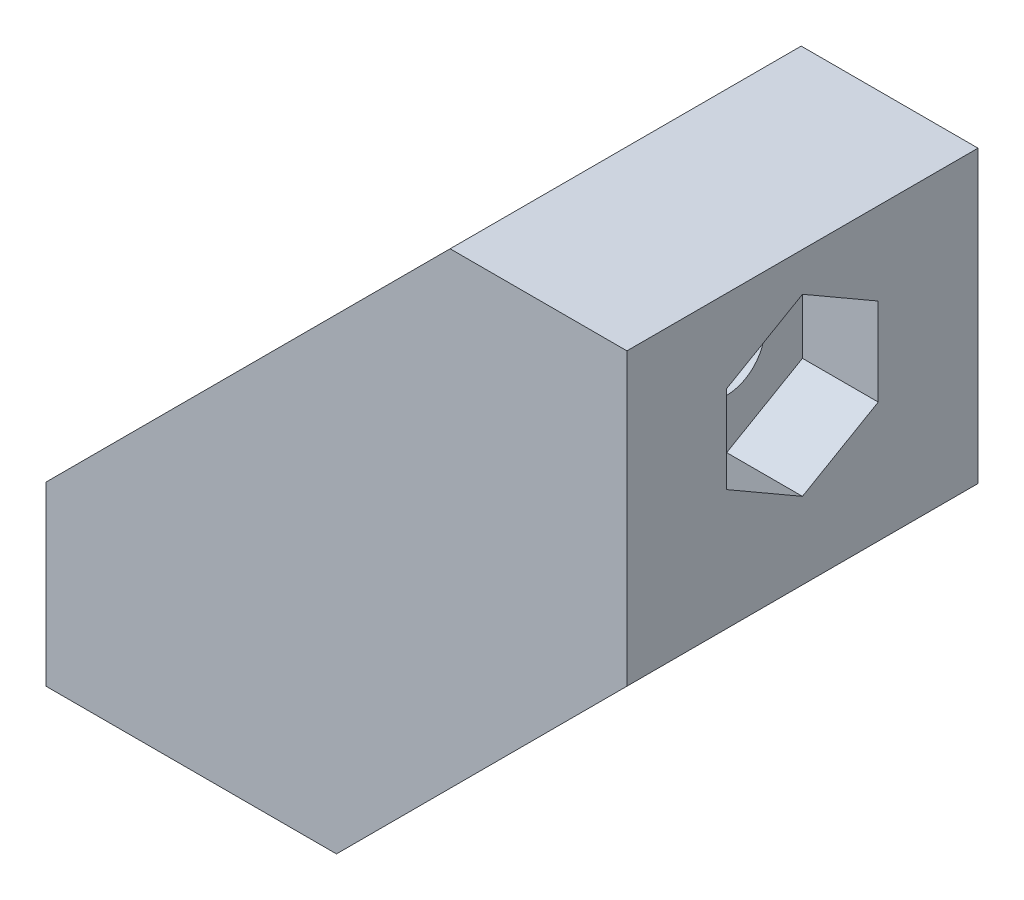
ISO-10303-21;
HEADER;
FILE_DESCRIPTION(('STEP AP214'),'2;1');
FILE_NAME('part.step','',(''),(''),'','','');
FILE_SCHEMA(('AUTOMOTIVE_DESIGN { 1 0 10303 214 1 1 1 1 }'));
ENDSEC;
DATA;
#1=APPLICATION_CONTEXT('core data for automotive mechanical design processes');
#2=APPLICATION_PROTOCOL_DEFINITION('international standard','automotive_design',2000,#1);
#3=PRODUCT_CONTEXT('',#1,'mechanical');
#4=PRODUCT('Part','Part','',(#3));
#5=PRODUCT_RELATED_PRODUCT_CATEGORY('part','',(#4));
#6=PRODUCT_DEFINITION_FORMATION('','',#4);
#7=PRODUCT_DEFINITION_CONTEXT('part definition',#1,'design');
#8=PRODUCT_DEFINITION('design','',#6,#7);
#9=PRODUCT_DEFINITION_SHAPE('','',#8);
#10=(LENGTH_UNIT() NAMED_UNIT(*) SI_UNIT(.MILLI.,.METRE.));
#11=(NAMED_UNIT(*) PLANE_ANGLE_UNIT() SI_UNIT($,.RADIAN.));
#12=(NAMED_UNIT(*) SI_UNIT($,.STERADIAN.) SOLID_ANGLE_UNIT());
#13=UNCERTAINTY_MEASURE_WITH_UNIT(LENGTH_MEASURE(1.E-05),#10,'distance_accuracy_value','');
#14=(GEOMETRIC_REPRESENTATION_CONTEXT(3) GLOBAL_UNCERTAINTY_ASSIGNED_CONTEXT((#13)) GLOBAL_UNIT_ASSIGNED_CONTEXT((#10,
#11,#12)) REPRESENTATION_CONTEXT('',''));
#15=CARTESIAN_POINT('',(0.,0.,0.));
#16=DIRECTION('',(0.,0.,1.));
#17=DIRECTION('',(1.,0.,0.));
#18=AXIS2_PLACEMENT_3D('',#15,#16,#17);
#19=CARTESIAN_POINT('',(22.,11.,-3.95));
#20=DIRECTION('',(1.,0.,0.));
#21=DIRECTION('',(0.,1.,0.));
#22=AXIS2_PLACEMENT_3D('',#19,#20,#21);
#23=CYLINDRICAL_SURFACE('',#22,1.5);
#24=CARTESIAN_POINT('',(38.,11.,-3.95));
#25=DIRECTION('',(1.,0.,0.));
#26=DIRECTION('',(0.,0.,-1.));
#27=AXIS2_PLACEMENT_3D('',#24,#25,#26);
#28=CIRCLE('',#27,1.5);
#29=CARTESIAN_POINT('',(38.,12.5,-3.95));
#30=VERTEX_POINT('',#29);
#31=EDGE_CURVE('E358',#30,#30,#28,.F.);
#32=CARTESIAN_POINT('',(42.,11.,-3.95));
#33=DIRECTION('',(1.,0.,0.));
#34=DIRECTION('',(0.,1.,0.));
#35=AXIS2_PLACEMENT_3D('',#32,#33,#34);
#36=CIRCLE('',#35,1.5);
#37=CARTESIAN_POINT('',(42.,12.5,-3.95));
#38=VERTEX_POINT('',#37);
#39=EDGE_CURVE('E43',#38,#38,#36,.T.);
#40=CARTESIAN_POINT('',(38.,12.5,-3.95));
#41=CARTESIAN_POINT('',(38.0416666666667,12.5,-3.95));
#42=CARTESIAN_POINT('',(38.0833333333333,12.5,-3.95));
#43=CARTESIAN_POINT('',(38.1666666666667,12.5,-3.95));
#44=CARTESIAN_POINT('',(38.2083333333333,12.5,-3.95));
#45=CARTESIAN_POINT('',(38.2916666666667,12.5,-3.95));
#46=CARTESIAN_POINT('',(38.3333333333333,12.5,-3.95));
#47=CARTESIAN_POINT('',(38.4166666666667,12.5,-3.95));
#48=CARTESIAN_POINT('',(38.4583333333333,12.5,-3.95));
#49=CARTESIAN_POINT('',(38.5416666666667,12.5,-3.95));
#50=CARTESIAN_POINT('',(38.5833333333333,12.5,-3.95));
#51=CARTESIAN_POINT('',(38.6666666666667,12.5,-3.95));
#52=CARTESIAN_POINT('',(38.7083333333333,12.5,-3.95));
#53=CARTESIAN_POINT('',(38.7916666666667,12.5,-3.95));
#54=CARTESIAN_POINT('',(38.8333333333333,12.5,-3.95));
#55=CARTESIAN_POINT('',(38.9166666666667,12.5,-3.95));
#56=CARTESIAN_POINT('',(38.9583333333333,12.5,-3.95));
#57=CARTESIAN_POINT('',(39.0416666666667,12.5,-3.95));
#58=CARTESIAN_POINT('',(39.0833333333333,12.5,-3.95));
#59=CARTESIAN_POINT('',(39.1666666666667,12.5,-3.95));
#60=CARTESIAN_POINT('',(39.2083333333333,12.5,-3.95));
#61=CARTESIAN_POINT('',(39.2916666666667,12.5,-3.95));
#62=CARTESIAN_POINT('',(39.3333333333333,12.5,-3.95));
#63=CARTESIAN_POINT('',(39.4166666666667,12.5,-3.95));
#64=CARTESIAN_POINT('',(39.4583333333333,12.5,-3.95));
#65=CARTESIAN_POINT('',(39.5416666666667,12.5,-3.95));
#66=CARTESIAN_POINT('',(39.5833333333333,12.5,-3.95));
#67=CARTESIAN_POINT('',(39.6666666666667,12.5,-3.95));
#68=CARTESIAN_POINT('',(39.7083333333333,12.5,-3.95));
#69=CARTESIAN_POINT('',(39.7916666666667,12.5,-3.95));
#70=CARTESIAN_POINT('',(39.8333333333333,12.5,-3.95));
#71=CARTESIAN_POINT('',(39.9166666666667,12.5,-3.95));
#72=CARTESIAN_POINT('',(39.9583333333333,12.5,-3.95));
#73=CARTESIAN_POINT('',(40.0416666666667,12.5,-3.95));
#74=CARTESIAN_POINT('',(40.0833333333333,12.5,-3.95));
#75=CARTESIAN_POINT('',(40.1666666666667,12.5,-3.95));
#76=CARTESIAN_POINT('',(40.2083333333333,12.5,-3.95));
#77=CARTESIAN_POINT('',(40.2916666666667,12.5,-3.95));
#78=CARTESIAN_POINT('',(40.3333333333333,12.5,-3.95));
#79=CARTESIAN_POINT('',(40.4166666666667,12.5,-3.95));
#80=CARTESIAN_POINT('',(40.4583333333333,12.5,-3.95));
#81=CARTESIAN_POINT('',(40.5416666666667,12.5,-3.95));
#82=CARTESIAN_POINT('',(40.5833333333333,12.5,-3.95));
#83=CARTESIAN_POINT('',(40.6666666666667,12.5,-3.95));
#84=CARTESIAN_POINT('',(40.7083333333333,12.5,-3.95));
#85=CARTESIAN_POINT('',(40.7916666666667,12.5,-3.95));
#86=CARTESIAN_POINT('',(40.8333333333333,12.5,-3.95));
#87=CARTESIAN_POINT('',(40.9166666666667,12.5,-3.95));
#88=CARTESIAN_POINT('',(40.9583333333333,12.5,-3.95));
#89=CARTESIAN_POINT('',(41.0416666666667,12.5,-3.95));
#90=CARTESIAN_POINT('',(41.0833333333333,12.5,-3.95));
#91=CARTESIAN_POINT('',(41.1666666666667,12.5,-3.95));
#92=CARTESIAN_POINT('',(41.2083333333333,12.5,-3.95));
#93=CARTESIAN_POINT('',(41.2916666666667,12.5,-3.95));
#94=CARTESIAN_POINT('',(41.3333333333333,12.5,-3.95));
#95=CARTESIAN_POINT('',(41.4166666666667,12.5,-3.95));
#96=CARTESIAN_POINT('',(41.4583333333333,12.5,-3.95));
#97=CARTESIAN_POINT('',(41.5416666666667,12.5,-3.95));
#98=CARTESIAN_POINT('',(41.5833333333333,12.5,-3.95));
#99=CARTESIAN_POINT('',(41.6666666666666,12.5,-3.95));
#100=CARTESIAN_POINT('',(41.7083333333333,12.5,-3.95));
#101=CARTESIAN_POINT('',(41.7916666666666,12.5,-3.95));
#102=CARTESIAN_POINT('',(41.8333333333333,12.5,-3.95));
#103=CARTESIAN_POINT('',(41.9166666666666,12.5,-3.95));
#104=CARTESIAN_POINT('',(41.9583333333333,12.5,-3.95));
#105=CARTESIAN_POINT('',(42.,12.5,-3.95));
#106=B_SPLINE_CURVE_WITH_KNOTS('',3,(#40,#41,#42,#43,#44,#45,#46,#47,#48,#49,#50,#51,#52,#53,
#54,#55,#56,#57,#58,#59,#60,#61,#62,#63,#64,#65,#66,#67,#68,#69,#70,#71,#72,#73,#74,#75,#76,#77,
#78,#79,#80,#81,#82,#83,#84,#85,#86,#87,#88,#89,#90,#91,#92,#93,#94,#95,#96,#97,#98,#99,#100,
#101,#102,#103,#104,#105),.UNSPECIFIED.,.F.,.F.,(4,2,2,2,2,2,2,2,2,2,2,2,2,2,2,2,2,2,2,2,2,2,2,
2,2,2,2,2,2,2,2,2,4),(0.,0.125,0.25,0.374999999999993,0.499999999999994,0.624999999999994,
0.749999999999994,0.874999999999994,0.999999999999994,1.12499999999999,1.24999999999999,
1.37499999999999,1.49999999999999,1.62499999999999,1.74999999999999,1.87499999999999,
1.99999999999999,2.12499999999999,2.24999999999999,2.37499999999998,2.49999999999998,
2.62499999999998,2.74999999999998,2.87499999999998,2.99999999999998,3.12499999999998,
3.24999999999998,3.37499999999998,3.49999999999998,3.62499999999998,3.74999999999998,
3.87499999999998,3.99999999999998),.UNSPECIFIED.);
#107=EDGE_CURVE('BSEAM39',#30,#38,#106,.T.);
#108=ORIENTED_EDGE('',*,*,#31,.T.);
#109=ORIENTED_EDGE('',*,*,#39,.T.);
#110=ORIENTED_EDGE('',*,*,#107,.T.);
#111=ORIENTED_EDGE('',*,*,#107,.F.);
#112=EDGE_LOOP('',(#108,#110,#109,#111));
#113=FACE_BOUND('',#112,.T.);
#114=ADVANCED_FACE('F39',(#113),#23,.F.);
#115=CARTESIAN_POINT('',(22.,0.,3.));
#116=DIRECTION('',(0.707106781186548,-0.707106781186547,0.));
#117=DIRECTION('',(0.707106781186547,0.707106781186548,0.));
#118=AXIS2_PLACEMENT_3D('',#115,#116,#117);
#119=PLANE('',#118);
#120=DIRECTION('',(0.,0.,-1.));
#121=VECTOR('',#120,1.);
#122=CARTESIAN_POINT('',(38.,16.,3.));
#123=LINE('',#122,#121);
#124=CARTESIAN_POINT('',(38.,16.,3.));
#125=VERTEX_POINT('',#124);
#126=CARTESIAN_POINT('',(38.,16.,0.3));
#127=VERTEX_POINT('',#126);
#128=EDGE_CURVE('E273',#125,#127,#123,.T.);
#129=ORIENTED_EDGE('',*,*,#128,.T.);
#130=DIRECTION('',(0.707106781186547,0.707106781186548,0.));
#131=VECTOR('',#130,1.);
#132=CARTESIAN_POINT('',(22.,0.,0.3));
#133=LINE('',#132,#131);
#134=CARTESIAN_POINT('',(22.,0.,0.3));
#135=VERTEX_POINT('',#134);
#136=EDGE_CURVE('E11',#135,#127,#133,.T.);
#137=ORIENTED_EDGE('',*,*,#136,.F.);
#138=DIRECTION('',(0.,0.,-1.));
#139=VECTOR('',#138,1.);
#140=CARTESIAN_POINT('',(22.,0.,3.));
#141=LINE('',#140,#139);
#142=CARTESIAN_POINT('',(22.,0.,3.));
#143=VERTEX_POINT('',#142);
#144=EDGE_CURVE('E269',#143,#135,#141,.T.);
#145=ORIENTED_EDGE('',*,*,#144,.F.);
#146=DIRECTION('',(-0.707106781186547,-0.707106781186548,0.));
#147=VECTOR('',#146,1.);
#148=CARTESIAN_POINT('',(22.,0.,3.));
#149=LINE('',#148,#147);
#150=EDGE_CURVE('E266',#125,#143,#149,.T.);
#151=ORIENTED_EDGE('',*,*,#150,.F.);
#152=EDGE_LOOP('',(#129,#137,#145,#151));
#153=FACE_BOUND('',#152,.T.);
#154=ADVANCED_FACE('F527',(#153),#119,.F.);
#155=CARTESIAN_POINT('',(11.,-11.,-10.9));
#156=DIRECTION('',(0.707106781186548,-0.707106781186547,0.));
#157=DIRECTION('',(0.707106781186547,0.707106781186548,0.));
#158=AXIS2_PLACEMENT_3D('',#155,#156,#157);
#159=PLANE('',#158);
#160=DIRECTION('',(-0.707106781186547,-0.707106781186548,0.));
#161=VECTOR('',#160,1.);
#162=CARTESIAN_POINT('',(11.,-11.,-8.2));
#163=LINE('',#162,#161);
#164=CARTESIAN_POINT('',(38.,16.,-8.2));
#165=VERTEX_POINT('',#164);
#166=CARTESIAN_POINT('',(22.,0.,-8.2));
#167=VERTEX_POINT('',#166);
#168=EDGE_CURVE('E49',#165,#167,#163,.T.);
#169=ORIENTED_EDGE('',*,*,#168,.F.);
#170=DIRECTION('',(0.,0.,1.));
#171=VECTOR('',#170,1.);
#172=CARTESIAN_POINT('',(38.,16.,-10.9));
#173=LINE('',#172,#171);
#174=CARTESIAN_POINT('',(38.,16.,-10.9));
#175=VERTEX_POINT('',#174);
#176=EDGE_CURVE('E219',#175,#165,#173,.T.);
#177=ORIENTED_EDGE('',*,*,#176,.F.);
#178=DIRECTION('',(0.707106781186547,0.707106781186548,0.));
#179=VECTOR('',#178,1.);
#180=CARTESIAN_POINT('',(11.,-11.,-10.9));
#181=LINE('',#180,#179);
#182=CARTESIAN_POINT('',(22.,0.,-10.9));
#183=VERTEX_POINT('',#182);
#184=EDGE_CURVE('E244',#183,#175,#181,.T.);
#185=ORIENTED_EDGE('',*,*,#184,.F.);
#186=DIRECTION('',(0.,0.,1.));
#187=VECTOR('',#186,1.);
#188=CARTESIAN_POINT('',(22.,0.,-10.9));
#189=LINE('',#188,#187);
#190=EDGE_CURVE('E222',#183,#167,#189,.T.);
#191=ORIENTED_EDGE('',*,*,#190,.T.);
#192=EDGE_LOOP('',(#169,#177,#185,#191));
#193=FACE_BOUND('',#192,.T.);
#194=ADVANCED_FACE('F217',(#193),#159,.F.);
#195=CARTESIAN_POINT('',(0.,-7.,-40.4269119345812));
#196=DIRECTION('',(0.,1.,0.));
#197=DIRECTION('',(-1.,0.,0.));
#198=AXIS2_PLACEMENT_3D('',#195,#196,#197);
#199=PLANE('',#198);
#200=DIRECTION('',(0.,0.,1.));
#201=VECTOR('',#200,1.);
#202=CARTESIAN_POINT('',(22.,-7.,-40.4269119345812));
#203=LINE('',#202,#201);
#204=CARTESIAN_POINT('',(22.,-7.,-10.9));
#205=VERTEX_POINT('',#204);
#206=CARTESIAN_POINT('',(22.,-7.,3.));
#207=VERTEX_POINT('',#206);
#208=EDGE_CURVE('E345',#205,#207,#203,.T.);
#209=ORIENTED_EDGE('',*,*,#208,.F.);
#210=DIRECTION('',(-1.,0.,0.));
#211=VECTOR('',#210,1.);
#212=CARTESIAN_POINT('',(0.,-7.00000000000001,-10.9));
#213=LINE('',#212,#211);
#214=CARTESIAN_POINT('',(33.5,-7.,-10.9));
#215=VERTEX_POINT('',#214);
#216=EDGE_CURVE('E404',#215,#205,#213,.T.);
#217=ORIENTED_EDGE('',*,*,#216,.F.);
#218=DIRECTION('',(0.,0.,1.));
#219=VECTOR('',#218,1.);
#220=CARTESIAN_POINT('',(33.5,-7.,-40.4269119345812));
#221=LINE('',#220,#219);
#222=CARTESIAN_POINT('',(33.5,-7.,3.));
#223=VERTEX_POINT('',#222);
#224=EDGE_CURVE('E227',#215,#223,#221,.T.);
#225=ORIENTED_EDGE('',*,*,#224,.T.);
#226=DIRECTION('',(1.,0.,0.));
#227=VECTOR('',#226,1.);
#228=CARTESIAN_POINT('',(22.,-7.,3.));
#229=LINE('',#228,#227);
#230=EDGE_CURVE('E251',#207,#223,#229,.T.);
#231=ORIENTED_EDGE('',*,*,#230,.F.);
#232=EDGE_LOOP('',(#209,#217,#225,#231));
#233=FACE_BOUND('',#232,.T.);
#234=DIRECTION('',(1.,0.,0.));
#235=VECTOR('',#234,1.);
#236=CARTESIAN_POINT('',(28.7320508075689,-7.,-0.950000000000001));
#237=LINE('',#236,#235);
#238=CARTESIAN_POINT('',(25.2679491924311,-7.,-0.95));
#239=VERTEX_POINT('',#238);
#240=CARTESIAN_POINT('',(28.7320508075689,-7.,-0.950000000000001));
#241=VERTEX_POINT('',#240);
#242=EDGE_CURVE('E276',#239,#241,#237,.T.);
#243=ORIENTED_EDGE('',*,*,#242,.T.);
#244=DIRECTION('',(0.500000000000001,0.,-0.866025403784438));
#245=VECTOR('',#244,1.);
#246=CARTESIAN_POINT('',(30.4641016151378,-7.,-3.95));
#247=LINE('',#246,#245);
#248=CARTESIAN_POINT('',(30.4641016151378,-7.,-3.95));
#249=VERTEX_POINT('',#248);
#250=EDGE_CURVE('E301',#241,#249,#247,.T.);
#251=ORIENTED_EDGE('',*,*,#250,.T.);
#252=DIRECTION('',(-0.5,0.,-0.866025403784439));
#253=VECTOR('',#252,1.);
#254=CARTESIAN_POINT('',(28.7320508075689,-7.,-6.95));
#255=LINE('',#254,#253);
#256=CARTESIAN_POINT('',(28.7320508075689,-7.,-6.95));
#257=VERTEX_POINT('',#256);
#258=EDGE_CURVE('E305',#249,#257,#255,.T.);
#259=ORIENTED_EDGE('',*,*,#258,.T.);
#260=DIRECTION('',(-1.,0.,0.));
#261=VECTOR('',#260,1.);
#262=CARTESIAN_POINT('',(25.2679491924311,-7.,-6.95));
#263=LINE('',#262,#261);
#264=CARTESIAN_POINT('',(25.2679491924311,-7.,-6.95));
#265=VERTEX_POINT('',#264);
#266=EDGE_CURVE('E309',#257,#265,#263,.T.);
#267=ORIENTED_EDGE('',*,*,#266,.T.);
#268=DIRECTION('',(-0.500000000000001,0.,0.866025403784438));
#269=VECTOR('',#268,1.);
#270=CARTESIAN_POINT('',(23.5358983848622,-7.,-3.95));
#271=LINE('',#270,#269);
#272=CARTESIAN_POINT('',(23.5358983848622,-7.,-3.95));
#273=VERTEX_POINT('',#272);
#274=EDGE_CURVE('E313',#265,#273,#271,.T.);
#275=ORIENTED_EDGE('',*,*,#274,.T.);
#276=DIRECTION('',(0.5,0.,0.866025403784439));
#277=VECTOR('',#276,1.);
#278=CARTESIAN_POINT('',(25.2679491924311,-7.,-0.950000000000001));
#279=LINE('',#278,#277);
#280=EDGE_CURVE('E282',#273,#239,#279,.T.);
#281=ORIENTED_EDGE('',*,*,#280,.T.);
#282=EDGE_LOOP('',(#243,#251,#259,#267,#275,#281));
#283=FACE_BOUND('',#282,.T.);
#284=ADVANCED_FACE('F544',(#233,#283),#199,.F.);
#285=CARTESIAN_POINT('',(27.,16.,-3.95));
#286=DIRECTION('',(0.,-1.,0.));
#287=DIRECTION('',(1.,0.,0.));
#288=AXIS2_PLACEMENT_3D('',#285,#286,#287);
#289=CYLINDRICAL_SURFACE('',#288,1.5);
#290=CARTESIAN_POINT('',(27.,0.,-3.95));
#291=DIRECTION('',(0.,1.,0.));
#292=DIRECTION('',(0.,0.,1.));
#293=AXIS2_PLACEMENT_3D('',#290,#291,#292);
#294=CIRCLE('',#293,1.5);
#295=CARTESIAN_POINT('',(27.,0.,-2.45));
#296=VERTEX_POINT('',#295);
#297=EDGE_CURVE('E340',#296,#296,#294,.T.);
#298=ORIENTED_EDGE('',*,*,#297,.T.);
#299=EDGE_LOOP('',(#298));
#300=FACE_BOUND('',#299,.T.);
#301=CARTESIAN_POINT('',(27.,-4.,-3.95));
#302=DIRECTION('',(0.,-1.,0.));
#303=DIRECTION('',(1.,0.,0.));
#304=AXIS2_PLACEMENT_3D('',#301,#302,#303);
#305=CIRCLE('',#304,1.5);
#306=CARTESIAN_POINT('',(28.5,-4.,-3.95));
#307=VERTEX_POINT('',#306);
#308=EDGE_CURVE('E339',#307,#307,#305,.F.);
#309=ORIENTED_EDGE('',*,*,#308,.F.);
#310=EDGE_LOOP('',(#309));
#311=FACE_BOUND('',#310,.T.);
#312=ADVANCED_FACE('F576',(#300,#311),#289,.F.);
#313=CARTESIAN_POINT('',(20.25,-20.25,-40.4269119345812));
#314=DIRECTION('',(0.707106781186548,-0.707106781186548,0.));
#315=DIRECTION('',(0.707106781186548,0.707106781186548,0.));
#316=AXIS2_PLACEMENT_3D('',#313,#314,#315);
#317=PLANE('',#316);
#318=ORIENTED_EDGE('',*,*,#224,.F.);
#319=DIRECTION('',(-0.707106781186547,-0.707106781186548,0.));
#320=VECTOR('',#319,1.);
#321=CARTESIAN_POINT('',(20.25,-20.25,-10.9));
#322=LINE('',#321,#320);
#323=CARTESIAN_POINT('',(45.,4.5,-10.9));
#324=VERTEX_POINT('',#323);
#325=EDGE_CURVE('E400',#324,#215,#322,.T.);
#326=ORIENTED_EDGE('',*,*,#325,.F.);
#327=DIRECTION('',(0.,0.,1.));
#328=VECTOR('',#327,1.);
#329=CARTESIAN_POINT('',(45.,4.5,-40.4269119345812));
#330=LINE('',#329,#328);
#331=CARTESIAN_POINT('',(45.,4.5,3.));
#332=VERTEX_POINT('',#331);
#333=EDGE_CURVE('E344',#324,#332,#330,.T.);
#334=ORIENTED_EDGE('',*,*,#333,.T.);
#335=DIRECTION('',(0.707106781186547,0.707106781186548,0.));
#336=VECTOR('',#335,1.);
#337=CARTESIAN_POINT('',(33.5,-7.,3.));
#338=LINE('',#337,#336);
#339=EDGE_CURVE('E255',#223,#332,#338,.T.);
#340=ORIENTED_EDGE('',*,*,#339,.F.);
#341=EDGE_LOOP('',(#318,#326,#334,#340));
#342=FACE_BOUND('',#341,.T.);
#343=ADVANCED_FACE('F41',(#342),#317,.T.);
#344=CARTESIAN_POINT('',(45.,0.,-40.4269119345812));
#345=DIRECTION('',(1.,0.,0.));
#346=DIRECTION('',(0.,0.,-1.));
#347=AXIS2_PLACEMENT_3D('',#344,#345,#346);
#348=PLANE('',#347);
#349=DIRECTION('',(0.,-1.,0.));
#350=VECTOR('',#349,1.);
#351=CARTESIAN_POINT('',(45.,9.26794919243114,-0.950000000000001));
#352=LINE('',#351,#350);
#353=CARTESIAN_POINT('',(45.,12.7320508075689,-0.950000000000001));
#354=VERTEX_POINT('',#353);
#355=CARTESIAN_POINT('',(45.,9.26794919243115,-0.95));
#356=VERTEX_POINT('',#355);
#357=EDGE_CURVE('E65',#354,#356,#352,.T.);
#358=ORIENTED_EDGE('',*,*,#357,.F.);
#359=DIRECTION('',(0.,-0.5,0.866025403784439));
#360=VECTOR('',#359,1.);
#361=CARTESIAN_POINT('',(45.,12.7320508075689,-0.950000000000001));
#362=LINE('',#361,#360);
#363=CARTESIAN_POINT('',(45.,14.4641016151378,-3.95));
#364=VERTEX_POINT('',#363);
#365=EDGE_CURVE('E435',#364,#354,#362,.T.);
#366=ORIENTED_EDGE('',*,*,#365,.F.);
#367=DIRECTION('',(0.,0.500000000000001,0.866025403784438));
#368=VECTOR('',#367,1.);
#369=CARTESIAN_POINT('',(45.,14.4641016151378,-3.95));
#370=LINE('',#369,#368);
#371=CARTESIAN_POINT('',(45.,12.7320508075689,-6.95));
#372=VERTEX_POINT('',#371);
#373=EDGE_CURVE('E468',#372,#364,#370,.T.);
#374=ORIENTED_EDGE('',*,*,#373,.F.);
#375=DIRECTION('',(0.,1.,0.));
#376=VECTOR('',#375,1.);
#377=CARTESIAN_POINT('',(45.,12.7320508075689,-6.95));
#378=LINE('',#377,#376);
#379=CARTESIAN_POINT('',(45.,9.26794919243114,-6.95));
#380=VERTEX_POINT('',#379);
#381=EDGE_CURVE('E472',#380,#372,#378,.T.);
#382=ORIENTED_EDGE('',*,*,#381,.F.);
#383=DIRECTION('',(0.,0.5,-0.866025403784439));
#384=VECTOR('',#383,1.);
#385=CARTESIAN_POINT('',(45.,9.26794919243114,-6.95));
#386=LINE('',#385,#384);
#387=CARTESIAN_POINT('',(45.,7.53589838486226,-3.95));
#388=VERTEX_POINT('',#387);
#389=EDGE_CURVE('E476',#388,#380,#386,.T.);
#390=ORIENTED_EDGE('',*,*,#389,.F.);
#391=DIRECTION('',(0.,-0.500000000000001,-0.866025403784438));
#392=VECTOR('',#391,1.);
#393=CARTESIAN_POINT('',(45.,7.53589838486226,-3.95));
#394=LINE('',#393,#392);
#395=EDGE_CURVE('E445',#356,#388,#394,.T.);
#396=ORIENTED_EDGE('',*,*,#395,.F.);
#397=EDGE_LOOP('',(#358,#366,#374,#382,#390,#396));
#398=FACE_BOUND('',#397,.T.);
#399=ORIENTED_EDGE('',*,*,#333,.F.);
#400=DIRECTION('',(0.,-1.,0.));
#401=VECTOR('',#400,1.);
#402=CARTESIAN_POINT('',(45.,0.,-10.9));
#403=LINE('',#402,#401);
#404=CARTESIAN_POINT('',(45.,16.,-10.9));
#405=VERTEX_POINT('',#404);
#406=EDGE_CURVE('E396',#405,#324,#403,.T.);
#407=ORIENTED_EDGE('',*,*,#406,.F.);
#408=DIRECTION('',(0.,0.,1.));
#409=VECTOR('',#408,1.);
#410=CARTESIAN_POINT('',(45.,16.,-40.4269119345812));
#411=LINE('',#410,#409);
#412=CARTESIAN_POINT('',(45.,16.,3.));
#413=VERTEX_POINT('',#412);
#414=EDGE_CURVE('E212',#405,#413,#411,.T.);
#415=ORIENTED_EDGE('',*,*,#414,.T.);
#416=DIRECTION('',(0.,1.,0.));
#417=VECTOR('',#416,1.);
#418=CARTESIAN_POINT('',(45.,4.5,3.));
#419=LINE('',#418,#417);
#420=EDGE_CURVE('E259',#332,#413,#419,.T.);
#421=ORIENTED_EDGE('',*,*,#420,.F.);
#422=EDGE_LOOP('',(#399,#407,#415,#421));
#423=FACE_BOUND('',#422,.T.);
#424=ADVANCED_FACE('F502',(#398,#423),#348,.T.);
#425=CARTESIAN_POINT('',(0.,16.,-40.4269119345812));
#426=DIRECTION('',(0.,-1.,0.));
#427=DIRECTION('',(0.,0.,-1.));
#428=AXIS2_PLACEMENT_3D('',#425,#426,#427);
#429=PLANE('',#428);
#430=ORIENTED_EDGE('',*,*,#414,.F.);
#431=DIRECTION('',(1.,0.,0.));
#432=VECTOR('',#431,1.);
#433=CARTESIAN_POINT('',(0.,16.,-10.9));
#434=LINE('',#433,#432);
#435=EDGE_CURVE('E237',#175,#405,#434,.T.);
#436=ORIENTED_EDGE('',*,*,#435,.F.);
#437=ORIENTED_EDGE('',*,*,#176,.T.);
#438=DIRECTION('',(0.,0.,1.));
#439=VECTOR('',#438,1.);
#440=CARTESIAN_POINT('',(38.,16.,-40.4269119345812));
#441=LINE('',#440,#439);
#442=EDGE_CURVE('E197',#165,#127,#441,.T.);
#443=ORIENTED_EDGE('',*,*,#442,.T.);
#444=ORIENTED_EDGE('',*,*,#128,.F.);
#445=DIRECTION('',(-1.,0.,0.));
#446=VECTOR('',#445,1.);
#447=CARTESIAN_POINT('',(45.,16.,3.));
#448=LINE('',#447,#446);
#449=EDGE_CURVE('E263',#413,#125,#448,.T.);
#450=ORIENTED_EDGE('',*,*,#449,.F.);
#451=EDGE_LOOP('',(#430,#436,#437,#443,#444,#450));
#452=FACE_BOUND('',#451,.T.);
#453=ADVANCED_FACE('F235',(#452),#429,.F.);
#454=CARTESIAN_POINT('',(38.,0.,-40.4269119345812));
#455=DIRECTION('',(1.,0.,0.));
#456=DIRECTION('',(0.,0.,-1.));
#457=AXIS2_PLACEMENT_3D('',#454,#455,#456);
#458=PLANE('',#457);
#459=DIRECTION('',(0.,-1.,0.));
#460=VECTOR('',#459,1.);
#461=CARTESIAN_POINT('',(38.,16.,0.3));
#462=LINE('',#461,#460);
#463=CARTESIAN_POINT('',(38.,7.69520213548322,0.3));
#464=VERTEX_POINT('',#463);
#465=EDGE_CURVE('E205',#127,#464,#462,.T.);
#466=ORIENTED_EDGE('',*,*,#465,.F.);
#467=ORIENTED_EDGE('',*,*,#442,.F.);
#468=DIRECTION('',(0.,1.,0.));
#469=VECTOR('',#468,1.);
#470=CARTESIAN_POINT('',(38.,16.,-8.2));
#471=LINE('',#470,#469);
#472=CARTESIAN_POINT('',(38.,7.69520213548322,-8.2));
#473=VERTEX_POINT('',#472);
#474=EDGE_CURVE('E203',#473,#165,#471,.T.);
#475=ORIENTED_EDGE('',*,*,#474,.F.);
#476=DIRECTION('',(0.,0.,-1.));
#477=VECTOR('',#476,1.);
#478=CARTESIAN_POINT('',(38.,7.69520213548322,-8.2));
#479=LINE('',#478,#477);
#480=EDGE_CURVE('E233',#464,#473,#479,.T.);
#481=ORIENTED_EDGE('',*,*,#480,.F.);
#482=EDGE_LOOP('',(#466,#467,#475,#481));
#483=FACE_BOUND('',#482,.T.);
#484=ORIENTED_EDGE('',*,*,#31,.F.);
#485=EDGE_LOOP('',(#484));
#486=FACE_BOUND('',#485,.T.);
#487=ADVANCED_FACE('F199',(#483,#486),#458,.F.);
#488=CARTESIAN_POINT('',(0.,0.,-40.4269119345812));
#489=DIRECTION('',(0.,1.,0.));
#490=DIRECTION('',(0.,0.,1.));
#491=AXIS2_PLACEMENT_3D('',#488,#489,#490);
#492=PLANE('',#491);
#493=DIRECTION('',(0.,0.,1.));
#494=VECTOR('',#493,1.);
#495=CARTESIAN_POINT('',(22.,0.,-40.4269119345812));
#496=LINE('',#495,#494);
#497=EDGE_CURVE('E211',#167,#135,#496,.T.);
#498=ORIENTED_EDGE('',*,*,#497,.T.);
#499=DIRECTION('',(1.,0.,0.));
#500=VECTOR('',#499,1.);
#501=CARTESIAN_POINT('',(22.,0.,0.3));
#502=LINE('',#501,#500);
#503=CARTESIAN_POINT('',(30.3047978645168,0.,0.3));
#504=VERTEX_POINT('',#503);
#505=EDGE_CURVE('E361',#135,#504,#502,.T.);
#506=ORIENTED_EDGE('',*,*,#505,.T.);
#507=DIRECTION('',(0.,0.,-1.));
#508=VECTOR('',#507,1.);
#509=CARTESIAN_POINT('',(30.3047978645168,0.,-8.2));
#510=LINE('',#509,#508);
#511=CARTESIAN_POINT('',(30.3047978645168,0.,-8.2));
#512=VERTEX_POINT('',#511);
#513=EDGE_CURVE('E367',#504,#512,#510,.T.);
#514=ORIENTED_EDGE('',*,*,#513,.T.);
#515=DIRECTION('',(-1.,0.,0.));
#516=VECTOR('',#515,1.);
#517=CARTESIAN_POINT('',(22.,0.,-8.2));
#518=LINE('',#517,#516);
#519=EDGE_CURVE('E386',#512,#167,#518,.T.);
#520=ORIENTED_EDGE('',*,*,#519,.T.);
#521=EDGE_LOOP('',(#498,#506,#514,#520));
#522=FACE_BOUND('',#521,.T.);
#523=ORIENTED_EDGE('',*,*,#297,.F.);
#524=EDGE_LOOP('',(#523));
#525=FACE_BOUND('',#524,.T.);
#526=ADVANCED_FACE('F422',(#522,#525),#492,.T.);
#527=CARTESIAN_POINT('',(22.,0.,-40.4269119345812));
#528=DIRECTION('',(-1.,0.,0.));
#529=DIRECTION('',(0.,-1.,0.));
#530=AXIS2_PLACEMENT_3D('',#527,#528,#529);
#531=PLANE('',#530);
#532=ORIENTED_EDGE('',*,*,#497,.F.);
#533=ORIENTED_EDGE('',*,*,#190,.F.);
#534=DIRECTION('',(0.,1.,0.));
#535=VECTOR('',#534,1.);
#536=CARTESIAN_POINT('',(22.,0.,-10.9));
#537=LINE('',#536,#535);
#538=EDGE_CURVE('E408',#205,#183,#537,.T.);
#539=ORIENTED_EDGE('',*,*,#538,.F.);
#540=ORIENTED_EDGE('',*,*,#208,.T.);
#541=DIRECTION('',(0.,-1.,0.));
#542=VECTOR('',#541,1.);
#543=CARTESIAN_POINT('',(22.,0.,3.));
#544=LINE('',#543,#542);
#545=EDGE_CURVE('E242',#143,#207,#544,.T.);
#546=ORIENTED_EDGE('',*,*,#545,.F.);
#547=ORIENTED_EDGE('',*,*,#144,.T.);
#548=EDGE_LOOP('',(#532,#533,#539,#540,#546,#547));
#549=FACE_BOUND('',#548,.T.);
#550=ADVANCED_FACE('F417',(#549),#531,.T.);
#551=CARTESIAN_POINT('',(0.,-4.00000000000001,0.));
#552=DIRECTION('',(0.,-1.,0.));
#553=DIRECTION('',(1.,0.,0.));
#554=AXIS2_PLACEMENT_3D('',#551,#552,#553);
#555=PLANE('',#554);
#556=DIRECTION('',(1.,0.,0.));
#557=VECTOR('',#556,1.);
#558=CARTESIAN_POINT('',(28.7320508075689,-4.,-0.950000000000001));
#559=LINE('',#558,#557);
#560=CARTESIAN_POINT('',(25.2679491924311,-4.,-0.950000000000001));
#561=VERTEX_POINT('',#560);
#562=CARTESIAN_POINT('',(28.7320508075689,-4.,-0.950000000000001));
#563=VERTEX_POINT('',#562);
#564=EDGE_CURVE('E277',#561,#563,#559,.T.);
#565=ORIENTED_EDGE('',*,*,#564,.F.);
#566=DIRECTION('',(0.5,0.,0.866025403784439));
#567=VECTOR('',#566,1.);
#568=CARTESIAN_POINT('',(25.2679491924311,-4.,-0.950000000000001));
#569=LINE('',#568,#567);
#570=CARTESIAN_POINT('',(23.5358983848622,-4.,-3.95));
#571=VERTEX_POINT('',#570);
#572=EDGE_CURVE('E294',#571,#561,#569,.T.);
#573=ORIENTED_EDGE('',*,*,#572,.F.);
#574=DIRECTION('',(-0.500000000000001,0.,0.866025403784438));
#575=VECTOR('',#574,1.);
#576=CARTESIAN_POINT('',(23.5358983848622,-4.,-3.95));
#577=LINE('',#576,#575);
#578=CARTESIAN_POINT('',(25.2679491924311,-4.,-6.95));
#579=VERTEX_POINT('',#578);
#580=EDGE_CURVE('E291',#579,#571,#577,.T.);
#581=ORIENTED_EDGE('',*,*,#580,.F.);
#582=DIRECTION('',(-1.,0.,0.));
#583=VECTOR('',#582,1.);
#584=CARTESIAN_POINT('',(25.2679491924311,-4.,-6.95));
#585=LINE('',#584,#583);
#586=CARTESIAN_POINT('',(28.7320508075689,-4.,-6.95));
#587=VERTEX_POINT('',#586);
#588=EDGE_CURVE('E288',#587,#579,#585,.T.);
#589=ORIENTED_EDGE('',*,*,#588,.F.);
#590=DIRECTION('',(-0.5,0.,-0.866025403784439));
#591=VECTOR('',#590,1.);
#592=CARTESIAN_POINT('',(28.7320508075689,-4.,-6.95));
#593=LINE('',#592,#591);
#594=CARTESIAN_POINT('',(30.4641016151378,-4.,-3.95));
#595=VERTEX_POINT('',#594);
#596=EDGE_CURVE('E285',#595,#587,#593,.T.);
#597=ORIENTED_EDGE('',*,*,#596,.F.);
#598=DIRECTION('',(0.500000000000001,0.,-0.866025403784438));
#599=VECTOR('',#598,1.);
#600=CARTESIAN_POINT('',(30.4641016151378,-4.,-3.95));
#601=LINE('',#600,#599);
#602=EDGE_CURVE('E281',#563,#595,#601,.T.);
#603=ORIENTED_EDGE('',*,*,#602,.F.);
#604=EDGE_LOOP('',(#565,#573,#581,#589,#597,#603));
#605=FACE_BOUND('',#604,.T.);
#606=ORIENTED_EDGE('',*,*,#308,.T.);
#607=EDGE_LOOP('',(#606));
#608=FACE_BOUND('',#607,.T.);
#609=ADVANCED_FACE('F549',(#605,#608),#555,.T.);
#610=CARTESIAN_POINT('',(28.7320508075689,-4.,-0.950000000000001));
#611=DIRECTION('',(0.,0.,-1.));
#612=DIRECTION('',(-1.,0.,0.));
#613=AXIS2_PLACEMENT_3D('',#610,#611,#612);
#614=PLANE('',#613);
#615=ORIENTED_EDGE('',*,*,#242,.F.);
#616=DIRECTION('',(0.,-1.,0.));
#617=VECTOR('',#616,1.);
#618=CARTESIAN_POINT('',(25.2679491924311,-4.,-0.950000000000001));
#619=LINE('',#618,#617);
#620=EDGE_CURVE('E297',#561,#239,#619,.T.);
#621=ORIENTED_EDGE('',*,*,#620,.F.);
#622=ORIENTED_EDGE('',*,*,#564,.T.);
#623=DIRECTION('',(0.,-1.,0.));
#624=VECTOR('',#623,1.);
#625=CARTESIAN_POINT('',(28.7320508075689,-4.,-0.950000000000001));
#626=LINE('',#625,#624);
#627=EDGE_CURVE('E335',#563,#241,#626,.T.);
#628=ORIENTED_EDGE('',*,*,#627,.T.);
#629=EDGE_LOOP('',(#615,#621,#622,#628));
#630=FACE_BOUND('',#629,.T.);
#631=ADVANCED_FACE('F552',(#630),#614,.T.);
#632=CARTESIAN_POINT('',(30.4641016151378,-4.,-3.95));
#633=DIRECTION('',(-0.866025403784438,0.,-0.500000000000001));
#634=DIRECTION('',(-0.500000000000001,0.,0.866025403784438));
#635=AXIS2_PLACEMENT_3D('',#632,#633,#634);
#636=PLANE('',#635);
#637=ORIENTED_EDGE('',*,*,#250,.F.);
#638=ORIENTED_EDGE('',*,*,#627,.F.);
#639=ORIENTED_EDGE('',*,*,#602,.T.);
#640=DIRECTION('',(0.,-1.,0.));
#641=VECTOR('',#640,1.);
#642=CARTESIAN_POINT('',(30.4641016151378,-4.,-3.95));
#643=LINE('',#642,#641);
#644=EDGE_CURVE('E332',#595,#249,#643,.T.);
#645=ORIENTED_EDGE('',*,*,#644,.T.);
#646=EDGE_LOOP('',(#637,#638,#639,#645));
#647=FACE_BOUND('',#646,.T.);
#648=ADVANCED_FACE('F568',(#647),#636,.T.);
#649=CARTESIAN_POINT('',(28.7320508075689,-4.,-6.95));
#650=DIRECTION('',(-0.866025403784439,0.,0.5));
#651=DIRECTION('',(0.5,0.,0.866025403784439));
#652=AXIS2_PLACEMENT_3D('',#649,#650,#651);
#653=PLANE('',#652);
#654=ORIENTED_EDGE('',*,*,#258,.F.);
#655=ORIENTED_EDGE('',*,*,#644,.F.);
#656=ORIENTED_EDGE('',*,*,#596,.T.);
#657=DIRECTION('',(0.,-1.,0.));
#658=VECTOR('',#657,1.);
#659=CARTESIAN_POINT('',(28.7320508075689,-4.,-6.95));
#660=LINE('',#659,#658);
#661=EDGE_CURVE('E329',#587,#257,#660,.T.);
#662=ORIENTED_EDGE('',*,*,#661,.T.);
#663=EDGE_LOOP('',(#654,#655,#656,#662));
#664=FACE_BOUND('',#663,.T.);
#665=ADVANCED_FACE('F564',(#664),#653,.T.);
#666=CARTESIAN_POINT('',(25.2679491924311,-4.,-6.95));
#667=DIRECTION('',(0.,0.,1.));
#668=DIRECTION('',(1.,0.,0.));
#669=AXIS2_PLACEMENT_3D('',#666,#667,#668);
#670=PLANE('',#669);
#671=ORIENTED_EDGE('',*,*,#266,.F.);
#672=ORIENTED_EDGE('',*,*,#661,.F.);
#673=ORIENTED_EDGE('',*,*,#588,.T.);
#674=DIRECTION('',(0.,-1.,0.));
#675=VECTOR('',#674,1.);
#676=CARTESIAN_POINT('',(25.2679491924311,-4.,-6.95));
#677=LINE('',#676,#675);
#678=EDGE_CURVE('E326',#579,#265,#677,.T.);
#679=ORIENTED_EDGE('',*,*,#678,.T.);
#680=EDGE_LOOP('',(#671,#672,#673,#679));
#681=FACE_BOUND('',#680,.T.);
#682=ADVANCED_FACE('F560',(#681),#670,.T.);
#683=CARTESIAN_POINT('',(23.5358983848622,-4.,-3.95));
#684=DIRECTION('',(0.866025403784438,0.,0.500000000000001));
#685=DIRECTION('',(0.500000000000001,0.,-0.866025403784438));
#686=AXIS2_PLACEMENT_3D('',#683,#684,#685);
#687=PLANE('',#686);
#688=ORIENTED_EDGE('',*,*,#274,.F.);
#689=ORIENTED_EDGE('',*,*,#678,.F.);
#690=ORIENTED_EDGE('',*,*,#580,.T.);
#691=DIRECTION('',(0.,-1.,0.));
#692=VECTOR('',#691,1.);
#693=CARTESIAN_POINT('',(23.5358983848622,-4.,-3.95));
#694=LINE('',#693,#692);
#695=EDGE_CURVE('E323',#571,#273,#694,.T.);
#696=ORIENTED_EDGE('',*,*,#695,.T.);
#697=EDGE_LOOP('',(#688,#689,#690,#696));
#698=FACE_BOUND('',#697,.T.);
#699=ADVANCED_FACE('F556',(#698),#687,.T.);
#700=CARTESIAN_POINT('',(25.2679491924311,-4.,-0.950000000000001));
#701=DIRECTION('',(0.866025403784438,0.,-0.5));
#702=DIRECTION('',(-0.5,0.,-0.866025403784439));
#703=AXIS2_PLACEMENT_3D('',#700,#701,#702);
#704=PLANE('',#703);
#705=ORIENTED_EDGE('',*,*,#280,.F.);
#706=ORIENTED_EDGE('',*,*,#695,.F.);
#707=ORIENTED_EDGE('',*,*,#572,.T.);
#708=ORIENTED_EDGE('',*,*,#620,.T.);
#709=EDGE_LOOP('',(#705,#706,#707,#708));
#710=FACE_BOUND('',#709,.T.);
#711=ADVANCED_FACE('F546',(#710),#704,.T.);
#712=CARTESIAN_POINT('',(0.,0.,3.));
#713=DIRECTION('',(0.,0.,1.));
#714=DIRECTION('',(1.,0.,0.));
#715=AXIS2_PLACEMENT_3D('',#712,#713,#714);
#716=PLANE('',#715);
#717=ORIENTED_EDGE('',*,*,#545,.T.);
#718=ORIENTED_EDGE('',*,*,#230,.T.);
#719=ORIENTED_EDGE('',*,*,#339,.T.);
#720=ORIENTED_EDGE('',*,*,#420,.T.);
#721=ORIENTED_EDGE('',*,*,#449,.T.);
#722=ORIENTED_EDGE('',*,*,#150,.T.);
#723=EDGE_LOOP('',(#717,#718,#719,#720,#721,#722));
#724=FACE_BOUND('',#723,.T.);
#725=ADVANCED_FACE('F541',(#724),#716,.T.);
#726=CARTESIAN_POINT('',(0.,0.,-10.9));
#727=DIRECTION('',(0.,0.,-1.));
#728=DIRECTION('',(-1.,0.,0.));
#729=AXIS2_PLACEMENT_3D('',#726,#727,#728);
#730=PLANE('',#729);
#731=ORIENTED_EDGE('',*,*,#406,.T.);
#732=ORIENTED_EDGE('',*,*,#325,.T.);
#733=ORIENTED_EDGE('',*,*,#216,.T.);
#734=ORIENTED_EDGE('',*,*,#538,.T.);
#735=ORIENTED_EDGE('',*,*,#184,.T.);
#736=ORIENTED_EDGE('',*,*,#435,.T.);
#737=EDGE_LOOP('',(#731,#732,#733,#734,#735,#736));
#738=FACE_BOUND('',#737,.T.);
#739=ADVANCED_FACE('F412',(#738),#730,.T.);
#740=CARTESIAN_POINT('',(22.,16.,0.3));
#741=DIRECTION('',(0.,0.,-1.));
#742=DIRECTION('',(-1.,0.,0.));
#743=AXIS2_PLACEMENT_3D('',#740,#741,#742);
#744=PLANE('',#743);
#745=ORIENTED_EDGE('',*,*,#136,.T.);
#746=ORIENTED_EDGE('',*,*,#465,.T.);
#747=DIRECTION('',(1.,0.,0.));
#748=VECTOR('',#747,1.);
#749=CARTESIAN_POINT('',(22.,7.6952021354832,0.3));
#750=LINE('',#749,#748);
#751=CARTESIAN_POINT('',(30.3047978645168,7.6952021354832,0.3));
#752=VERTEX_POINT('',#751);
#753=EDGE_CURVE('E57',#752,#464,#750,.T.);
#754=ORIENTED_EDGE('',*,*,#753,.F.);
#755=DIRECTION('',(0.,-1.,0.));
#756=VECTOR('',#755,1.);
#757=CARTESIAN_POINT('',(30.3047978645168,16.,0.3));
#758=LINE('',#757,#756);
#759=EDGE_CURVE('E393',#752,#504,#758,.T.);
#760=ORIENTED_EDGE('',*,*,#759,.T.);
#761=ORIENTED_EDGE('',*,*,#505,.F.);
#762=EDGE_LOOP('',(#745,#746,#754,#760,#761));
#763=FACE_BOUND('',#762,.T.);
#764=ADVANCED_FACE('F536',(#763),#744,.T.);
#765=CARTESIAN_POINT('',(30.3047978645168,16.,-8.2));
#766=DIRECTION('',(-1.,0.,0.));
#767=DIRECTION('',(0.,0.,1.));
#768=AXIS2_PLACEMENT_3D('',#765,#766,#767);
#769=PLANE('',#768);
#770=DIRECTION('',(0.,0.,1.));
#771=VECTOR('',#770,1.);
#772=CARTESIAN_POINT('',(30.3047978645168,7.69520213548321,-8.2));
#773=LINE('',#772,#771);
#774=CARTESIAN_POINT('',(30.3047978645168,7.69520213548321,-8.2));
#775=VERTEX_POINT('',#774);
#776=EDGE_CURVE('E429',#775,#752,#773,.T.);
#777=ORIENTED_EDGE('',*,*,#776,.F.);
#778=DIRECTION('',(0.,-1.,0.));
#779=VECTOR('',#778,1.);
#780=CARTESIAN_POINT('',(30.3047978645168,16.,-8.2));
#781=LINE('',#780,#779);
#782=EDGE_CURVE('E390',#775,#512,#781,.T.);
#783=ORIENTED_EDGE('',*,*,#782,.T.);
#784=ORIENTED_EDGE('',*,*,#513,.F.);
#785=ORIENTED_EDGE('',*,*,#759,.F.);
#786=EDGE_LOOP('',(#777,#783,#784,#785));
#787=FACE_BOUND('',#786,.T.);
#788=ADVANCED_FACE('F427',(#787),#769,.T.);
#789=CARTESIAN_POINT('',(22.,16.,-8.2));
#790=DIRECTION('',(0.,0.,1.));
#791=DIRECTION('',(1.,0.,0.));
#792=AXIS2_PLACEMENT_3D('',#789,#790,#791);
#793=PLANE('',#792);
#794=ORIENTED_EDGE('',*,*,#782,.F.);
#795=DIRECTION('',(1.,0.,0.));
#796=VECTOR('',#795,1.);
#797=CARTESIAN_POINT('',(22.,7.6952021354832,-8.2));
#798=LINE('',#797,#796);
#799=EDGE_CURVE('E231',#775,#473,#798,.T.);
#800=ORIENTED_EDGE('',*,*,#799,.T.);
#801=ORIENTED_EDGE('',*,*,#474,.T.);
#802=ORIENTED_EDGE('',*,*,#168,.T.);
#803=ORIENTED_EDGE('',*,*,#519,.F.);
#804=EDGE_LOOP('',(#794,#800,#801,#802,#803));
#805=FACE_BOUND('',#804,.T.);
#806=ADVANCED_FACE('F230',(#805),#793,.T.);
#807=CARTESIAN_POINT('',(42.,9.26794919243114,-0.950000000000001));
#808=DIRECTION('',(0.,0.,1.));
#809=DIRECTION('',(0.,-1.,0.));
#810=AXIS2_PLACEMENT_3D('',#807,#808,#809);
#811=PLANE('',#810);
#812=ORIENTED_EDGE('',*,*,#357,.T.);
#813=DIRECTION('',(1.,0.,0.));
#814=VECTOR('',#813,1.);
#815=CARTESIAN_POINT('',(42.,9.26794919243114,-0.950000000000001));
#816=LINE('',#815,#814);
#817=CARTESIAN_POINT('',(42.,9.26794919243114,-0.950000000000001));
#818=VERTEX_POINT('',#817);
#819=EDGE_CURVE('E464',#818,#356,#816,.T.);
#820=ORIENTED_EDGE('',*,*,#819,.F.);
#821=DIRECTION('',(0.,-1.,0.));
#822=VECTOR('',#821,1.);
#823=CARTESIAN_POINT('',(42.,9.26794919243114,-0.950000000000001));
#824=LINE('',#823,#822);
#825=CARTESIAN_POINT('',(42.,12.7320508075689,-0.950000000000001));
#826=VERTEX_POINT('',#825);
#827=EDGE_CURVE('E440',#826,#818,#824,.T.);
#828=ORIENTED_EDGE('',*,*,#827,.F.);
#829=DIRECTION('',(1.,0.,0.));
#830=VECTOR('',#829,1.);
#831=CARTESIAN_POINT('',(42.,12.7320508075689,-0.950000000000001));
#832=LINE('',#831,#830);
#833=EDGE_CURVE('E370',#826,#354,#832,.T.);
#834=ORIENTED_EDGE('',*,*,#833,.T.);
#835=EDGE_LOOP('',(#812,#820,#828,#834));
#836=FACE_BOUND('',#835,.T.);
#837=ADVANCED_FACE('F516',(#836),#811,.F.);
#838=CARTESIAN_POINT('',(42.,12.7320508075689,-0.950000000000001));
#839=DIRECTION('',(0.,0.866025403784438,0.5));
#840=DIRECTION('',(0.,-0.5,0.866025403784439));
#841=AXIS2_PLACEMENT_3D('',#838,#839,#840);
#842=PLANE('',#841);
#843=ORIENTED_EDGE('',*,*,#365,.T.);
#844=ORIENTED_EDGE('',*,*,#833,.F.);
#845=DIRECTION('',(0.,-0.5,0.866025403784439));
#846=VECTOR('',#845,1.);
#847=CARTESIAN_POINT('',(42.,12.7320508075689,-0.950000000000001));
#848=LINE('',#847,#846);
#849=CARTESIAN_POINT('',(42.,14.4641016151378,-3.95));
#850=VERTEX_POINT('',#849);
#851=EDGE_CURVE('E444',#850,#826,#848,.T.);
#852=ORIENTED_EDGE('',*,*,#851,.F.);
#853=DIRECTION('',(1.,0.,0.));
#854=VECTOR('',#853,1.);
#855=CARTESIAN_POINT('',(42.,14.4641016151378,-3.95));
#856=LINE('',#855,#854);
#857=EDGE_CURVE('E374',#850,#364,#856,.T.);
#858=ORIENTED_EDGE('',*,*,#857,.T.);
#859=EDGE_LOOP('',(#843,#844,#852,#858));
#860=FACE_BOUND('',#859,.T.);
#861=ADVANCED_FACE('F506',(#860),#842,.F.);
#862=CARTESIAN_POINT('',(42.,14.4641016151378,-3.95));
#863=DIRECTION('',(0.,0.866025403784438,-0.500000000000001));
#864=DIRECTION('',(0.,0.500000000000001,0.866025403784438));
#865=AXIS2_PLACEMENT_3D('',#862,#863,#864);
#866=PLANE('',#865);
#867=ORIENTED_EDGE('',*,*,#373,.T.);
#868=ORIENTED_EDGE('',*,*,#857,.F.);
#869=DIRECTION('',(0.,0.500000000000001,0.866025403784438));
#870=VECTOR('',#869,1.);
#871=CARTESIAN_POINT('',(42.,14.4641016151378,-3.95));
#872=LINE('',#871,#870);
#873=CARTESIAN_POINT('',(42.,12.7320508075689,-6.95));
#874=VERTEX_POINT('',#873);
#875=EDGE_CURVE('E449',#874,#850,#872,.T.);
#876=ORIENTED_EDGE('',*,*,#875,.F.);
#877=DIRECTION('',(1.,0.,0.));
#878=VECTOR('',#877,1.);
#879=CARTESIAN_POINT('',(42.,12.7320508075689,-6.95));
#880=LINE('',#879,#878);
#881=EDGE_CURVE('E379',#874,#372,#880,.T.);
#882=ORIENTED_EDGE('',*,*,#881,.T.);
#883=EDGE_LOOP('',(#867,#868,#876,#882));
#884=FACE_BOUND('',#883,.T.);
#885=ADVANCED_FACE('F493',(#884),#866,.F.);
#886=CARTESIAN_POINT('',(42.,12.7320508075689,-6.95));
#887=DIRECTION('',(0.,0.,-1.));
#888=DIRECTION('',(0.,1.,0.));
#889=AXIS2_PLACEMENT_3D('',#886,#887,#888);
#890=PLANE('',#889);
#891=ORIENTED_EDGE('',*,*,#381,.T.);
#892=ORIENTED_EDGE('',*,*,#881,.F.);
#893=DIRECTION('',(0.,1.,0.));
#894=VECTOR('',#893,1.);
#895=CARTESIAN_POINT('',(42.,12.7320508075689,-6.95));
#896=LINE('',#895,#894);
#897=CARTESIAN_POINT('',(42.,9.26794919243114,-6.95));
#898=VERTEX_POINT('',#897);
#899=EDGE_CURVE('E453',#898,#874,#896,.T.);
#900=ORIENTED_EDGE('',*,*,#899,.F.);
#901=DIRECTION('',(1.,0.,0.));
#902=VECTOR('',#901,1.);
#903=CARTESIAN_POINT('',(42.,9.26794919243114,-6.95));
#904=LINE('',#903,#902);
#905=EDGE_CURVE('E488',#898,#380,#904,.T.);
#906=ORIENTED_EDGE('',*,*,#905,.T.);
#907=EDGE_LOOP('',(#891,#892,#900,#906));
#908=FACE_BOUND('',#907,.T.);
#909=ADVANCED_FACE('F499',(#908),#890,.F.);
#910=CARTESIAN_POINT('',(42.,9.26794919243114,-6.95));
#911=DIRECTION('',(0.,-0.866025403784439,-0.5));
#912=DIRECTION('',(0.,0.5,-0.866025403784439));
#913=AXIS2_PLACEMENT_3D('',#910,#911,#912);
#914=PLANE('',#913);
#915=ORIENTED_EDGE('',*,*,#389,.T.);
#916=ORIENTED_EDGE('',*,*,#905,.F.);
#917=DIRECTION('',(0.,0.5,-0.866025403784439));
#918=VECTOR('',#917,1.);
#919=CARTESIAN_POINT('',(42.,9.26794919243114,-6.95));
#920=LINE('',#919,#918);
#921=CARTESIAN_POINT('',(42.,7.53589838486226,-3.95));
#922=VERTEX_POINT('',#921);
#923=EDGE_CURVE('E457',#922,#898,#920,.T.);
#924=ORIENTED_EDGE('',*,*,#923,.F.);
#925=DIRECTION('',(1.,0.,0.));
#926=VECTOR('',#925,1.);
#927=CARTESIAN_POINT('',(42.,7.53589838486226,-3.95));
#928=LINE('',#927,#926);
#929=EDGE_CURVE('E485',#922,#388,#928,.T.);
#930=ORIENTED_EDGE('',*,*,#929,.T.);
#931=EDGE_LOOP('',(#915,#916,#924,#930));
#932=FACE_BOUND('',#931,.T.);
#933=ADVANCED_FACE('F513',(#932),#914,.F.);
#934=CARTESIAN_POINT('',(42.,7.53589838486226,-3.95));
#935=DIRECTION('',(0.,-0.866025403784438,0.500000000000001));
#936=DIRECTION('',(0.,-0.500000000000001,-0.866025403784438));
#937=AXIS2_PLACEMENT_3D('',#934,#935,#936);
#938=PLANE('',#937);
#939=ORIENTED_EDGE('',*,*,#395,.T.);
#940=ORIENTED_EDGE('',*,*,#929,.F.);
#941=DIRECTION('',(0.,-0.500000000000001,-0.866025403784438));
#942=VECTOR('',#941,1.);
#943=CARTESIAN_POINT('',(42.,7.53589838486226,-3.95));
#944=LINE('',#943,#942);
#945=EDGE_CURVE('E461',#818,#922,#944,.T.);
#946=ORIENTED_EDGE('',*,*,#945,.F.);
#947=ORIENTED_EDGE('',*,*,#819,.T.);
#948=EDGE_LOOP('',(#939,#940,#946,#947));
#949=FACE_BOUND('',#948,.T.);
#950=ADVANCED_FACE('F515',(#949),#938,.F.);
#951=CARTESIAN_POINT('',(42.,38.,0.));
#952=DIRECTION('',(1.,0.,0.));
#953=DIRECTION('',(0.,-1.,0.));
#954=AXIS2_PLACEMENT_3D('',#951,#952,#953);
#955=PLANE('',#954);
#956=ORIENTED_EDGE('',*,*,#39,.F.);
#957=EDGE_LOOP('',(#956));
#958=FACE_BOUND('',#957,.T.);
#959=ORIENTED_EDGE('',*,*,#827,.T.);
#960=ORIENTED_EDGE('',*,*,#945,.T.);
#961=ORIENTED_EDGE('',*,*,#923,.T.);
#962=ORIENTED_EDGE('',*,*,#899,.T.);
#963=ORIENTED_EDGE('',*,*,#875,.T.);
#964=ORIENTED_EDGE('',*,*,#851,.T.);
#965=EDGE_LOOP('',(#959,#960,#961,#962,#963,#964));
#966=FACE_BOUND('',#965,.T.);
#967=ADVANCED_FACE('F509',(#958,#966),#955,.T.);
#968=CARTESIAN_POINT('',(22.,7.6952021354832,-8.2));
#969=DIRECTION('',(0.,-1.,0.));
#970=DIRECTION('',(1.,0.,0.));
#971=AXIS2_PLACEMENT_3D('',#968,#969,#970);
#972=PLANE('',#971);
#973=ORIENTED_EDGE('',*,*,#776,.T.);
#974=ORIENTED_EDGE('',*,*,#753,.T.);
#975=ORIENTED_EDGE('',*,*,#480,.T.);
#976=ORIENTED_EDGE('',*,*,#799,.F.);
#977=EDGE_LOOP('',(#973,#974,#975,#976));
#978=FACE_BOUND('',#977,.T.);
#979=ADVANCED_FACE('F609',(#978),#972,.F.);
#980=CLOSED_SHELL('',(#114,#154,#194,#284,#312,#343,#424,#453,#487,#526,#550,#609,#631,#648,
#665,#682,#699,#711,#725,#739,#764,#788,#806,#837,#861,#885,#909,#933,#950,#967,#979));
#981=MANIFOLD_SOLID_BREP('B2',#980);
#982=ADVANCED_BREP_SHAPE_REPRESENTATION('',(#18,#981),#14);
#983=SHAPE_DEFINITION_REPRESENTATION(#9,#982);
ENDSEC;
END-ISO-10303-21;
